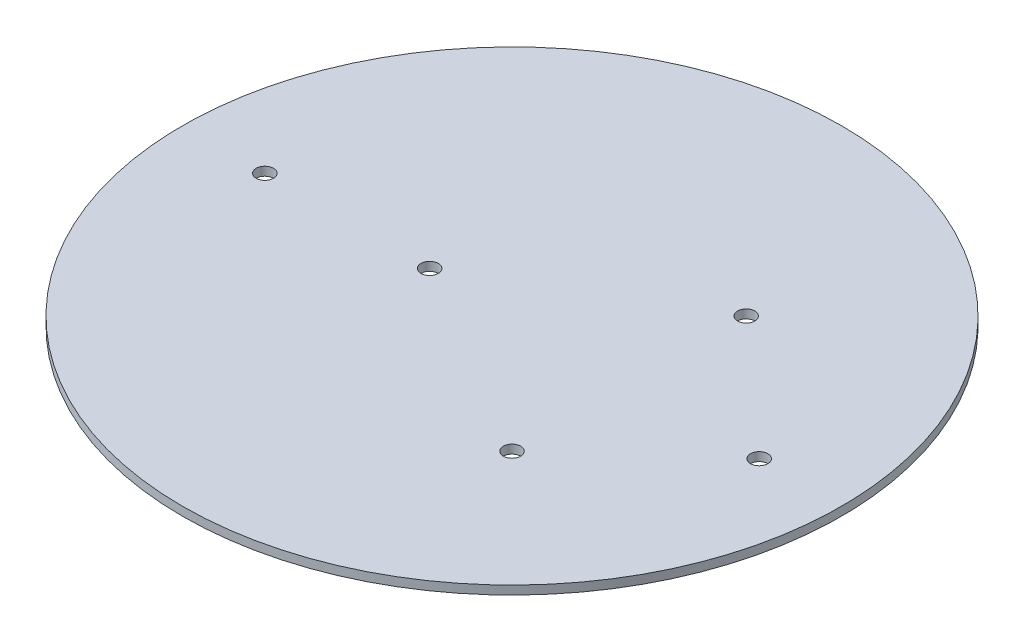
ISO-10303-21;
HEADER;
FILE_DESCRIPTION(('STEP AP214'),'2;1');
FILE_NAME('part.step','',(''),(''),'','','');
FILE_SCHEMA(('AUTOMOTIVE_DESIGN { 1 0 10303 214 1 1 1 1 }'));
ENDSEC;
DATA;
#1=APPLICATION_CONTEXT('core data for automotive mechanical design processes');
#2=APPLICATION_PROTOCOL_DEFINITION('international standard','automotive_design',2000,#1);
#3=PRODUCT_CONTEXT('',#1,'mechanical');
#4=PRODUCT('Part','Part','',(#3));
#5=PRODUCT_RELATED_PRODUCT_CATEGORY('part','',(#4));
#6=PRODUCT_DEFINITION_FORMATION('','',#4);
#7=PRODUCT_DEFINITION_CONTEXT('part definition',#1,'design');
#8=PRODUCT_DEFINITION('design','',#6,#7);
#9=PRODUCT_DEFINITION_SHAPE('','',#8);
#10=(LENGTH_UNIT() NAMED_UNIT(*) SI_UNIT(.MILLI.,.METRE.));
#11=(NAMED_UNIT(*) PLANE_ANGLE_UNIT() SI_UNIT($,.RADIAN.));
#12=(NAMED_UNIT(*) SI_UNIT($,.STERADIAN.) SOLID_ANGLE_UNIT());
#13=UNCERTAINTY_MEASURE_WITH_UNIT(LENGTH_MEASURE(1.E-05),#10,'distance_accuracy_value','');
#14=(GEOMETRIC_REPRESENTATION_CONTEXT(3) GLOBAL_UNCERTAINTY_ASSIGNED_CONTEXT((#13)) GLOBAL_UNIT_ASSIGNED_CONTEXT((#10,
#11,#12)) REPRESENTATION_CONTEXT('',''));
#15=CARTESIAN_POINT('',(0.,0.,0.));
#16=DIRECTION('',(0.,0.,1.));
#17=DIRECTION('',(1.,0.,0.));
#18=AXIS2_PLACEMENT_3D('',#15,#16,#17);
#19=CARTESIAN_POINT('',(28.5,-1.,0.));
#20=DIRECTION('',(0.,1.,0.));
#21=DIRECTION('',(0.,0.,1.));
#22=AXIS2_PLACEMENT_3D('',#19,#20,#21);
#23=CYLINDRICAL_SURFACE('',#22,1.);
#24=CARTESIAN_POINT('',(28.5,-1.,0.));
#25=DIRECTION('',(0.,1.,0.));
#26=DIRECTION('',(0.,0.,1.));
#27=AXIS2_PLACEMENT_3D('',#24,#25,#26);
#28=CIRCLE('',#27,1.);
#29=CARTESIAN_POINT('',(28.5,-1.,0.999999999999991));
#30=VERTEX_POINT('',#29);
#31=EDGE_CURVE('E52',#30,#30,#28,.T.);
#32=ORIENTED_EDGE('',*,*,#31,.F.);
#33=EDGE_LOOP('',(#32));
#34=FACE_BOUND('',#33,.T.);
#35=CARTESIAN_POINT('',(28.5,0.,0.));
#36=DIRECTION('',(0.,1.,0.));
#37=DIRECTION('',(0.,0.,1.));
#38=AXIS2_PLACEMENT_3D('',#35,#36,#37);
#39=CIRCLE('',#38,1.);
#40=CARTESIAN_POINT('',(28.5,0.,0.999999999999991));
#41=VERTEX_POINT('',#40);
#42=EDGE_CURVE('E77',#41,#41,#39,.T.);
#43=ORIENTED_EDGE('',*,*,#42,.T.);
#44=EDGE_LOOP('',(#43));
#45=FACE_BOUND('',#44,.T.);
#46=ADVANCED_FACE('F43',(#34,#45),#23,.F.);
#47=CARTESIAN_POINT('',(-28.5,-1.,0.));
#48=DIRECTION('',(0.,1.,0.));
#49=DIRECTION('',(0.,0.,1.));
#50=AXIS2_PLACEMENT_3D('',#47,#48,#49);
#51=CYLINDRICAL_SURFACE('',#50,1.);
#52=CARTESIAN_POINT('',(-28.5,-1.,0.));
#53=DIRECTION('',(0.,1.,0.));
#54=DIRECTION('',(0.,0.,1.));
#55=AXIS2_PLACEMENT_3D('',#52,#53,#54);
#56=CIRCLE('',#55,1.);
#57=CARTESIAN_POINT('',(-28.5,-1.,1.));
#58=VERTEX_POINT('',#57);
#59=EDGE_CURVE('E58',#58,#58,#56,.T.);
#60=ORIENTED_EDGE('',*,*,#59,.F.);
#61=EDGE_LOOP('',(#60));
#62=FACE_BOUND('',#61,.T.);
#63=CARTESIAN_POINT('',(-28.5,0.,0.));
#64=DIRECTION('',(0.,1.,0.));
#65=DIRECTION('',(0.,0.,1.));
#66=AXIS2_PLACEMENT_3D('',#63,#64,#65);
#67=CIRCLE('',#66,1.);
#68=CARTESIAN_POINT('',(-28.5,0.,1.));
#69=VERTEX_POINT('',#68);
#70=EDGE_CURVE('E74',#69,#69,#67,.T.);
#71=ORIENTED_EDGE('',*,*,#70,.T.);
#72=EDGE_LOOP('',(#71));
#73=FACE_BOUND('',#72,.T.);
#74=ADVANCED_FACE('F107',(#62,#73),#51,.F.);
#75=CARTESIAN_POINT('',(13.5,-1.,-13.5));
#76=DIRECTION('',(0.,1.,0.));
#77=DIRECTION('',(0.,0.,1.));
#78=AXIS2_PLACEMENT_3D('',#75,#76,#77);
#79=CYLINDRICAL_SURFACE('',#78,1.);
#80=CARTESIAN_POINT('',(13.5,-1.,-13.5));
#81=DIRECTION('',(0.,1.,0.));
#82=DIRECTION('',(0.,0.,1.));
#83=AXIS2_PLACEMENT_3D('',#80,#81,#82);
#84=CIRCLE('',#83,1.);
#85=CARTESIAN_POINT('',(13.5,-1.,-12.5));
#86=VERTEX_POINT('',#85);
#87=EDGE_CURVE('E95',#86,#86,#84,.T.);
#88=ORIENTED_EDGE('',*,*,#87,.F.);
#89=EDGE_LOOP('',(#88));
#90=FACE_BOUND('',#89,.T.);
#91=CARTESIAN_POINT('',(13.5,0.,-13.5));
#92=DIRECTION('',(0.,1.,0.));
#93=DIRECTION('',(0.,0.,1.));
#94=AXIS2_PLACEMENT_3D('',#91,#92,#93);
#95=CIRCLE('',#94,1.);
#96=CARTESIAN_POINT('',(13.5,0.,-12.5));
#97=VERTEX_POINT('',#96);
#98=EDGE_CURVE('E70',#97,#97,#95,.T.);
#99=ORIENTED_EDGE('',*,*,#98,.T.);
#100=EDGE_LOOP('',(#99));
#101=FACE_BOUND('',#100,.T.);
#102=ADVANCED_FACE('F110',(#90,#101),#79,.F.);
#103=CARTESIAN_POINT('',(13.5,-1.,13.5));
#104=DIRECTION('',(0.,1.,0.));
#105=DIRECTION('',(0.,0.,1.));
#106=AXIS2_PLACEMENT_3D('',#103,#104,#105);
#107=CYLINDRICAL_SURFACE('',#106,1.);
#108=CARTESIAN_POINT('',(13.5,-1.,13.5));
#109=DIRECTION('',(0.,1.,0.));
#110=DIRECTION('',(0.,0.,1.));
#111=AXIS2_PLACEMENT_3D('',#108,#109,#110);
#112=CIRCLE('',#111,1.);
#113=CARTESIAN_POINT('',(13.5,-1.,14.5));
#114=VERTEX_POINT('',#113);
#115=EDGE_CURVE('E89',#114,#114,#112,.T.);
#116=ORIENTED_EDGE('',*,*,#115,.F.);
#117=EDGE_LOOP('',(#116));
#118=FACE_BOUND('',#117,.T.);
#119=CARTESIAN_POINT('',(13.5,0.,13.5));
#120=DIRECTION('',(0.,1.,0.));
#121=DIRECTION('',(0.,0.,1.));
#122=AXIS2_PLACEMENT_3D('',#119,#120,#121);
#123=CIRCLE('',#122,1.);
#124=CARTESIAN_POINT('',(13.5,0.,14.5));
#125=VERTEX_POINT('',#124);
#126=EDGE_CURVE('E66',#125,#125,#123,.T.);
#127=ORIENTED_EDGE('',*,*,#126,.T.);
#128=EDGE_LOOP('',(#127));
#129=FACE_BOUND('',#128,.T.);
#130=ADVANCED_FACE('F135',(#118,#129),#107,.F.);
#131=CARTESIAN_POINT('',(-9.5,-1.,0.));
#132=DIRECTION('',(0.,1.,0.));
#133=DIRECTION('',(0.,0.,1.));
#134=AXIS2_PLACEMENT_3D('',#131,#132,#133);
#135=CYLINDRICAL_SURFACE('',#134,1.);
#136=CARTESIAN_POINT('',(-9.5,-1.,0.));
#137=DIRECTION('',(0.,1.,0.));
#138=DIRECTION('',(0.,0.,1.));
#139=AXIS2_PLACEMENT_3D('',#136,#137,#138);
#140=CIRCLE('',#139,1.);
#141=CARTESIAN_POINT('',(-9.5,-1.,1.));
#142=VERTEX_POINT('',#141);
#143=EDGE_CURVE('E84',#142,#142,#140,.T.);
#144=ORIENTED_EDGE('',*,*,#143,.F.);
#145=EDGE_LOOP('',(#144));
#146=FACE_BOUND('',#145,.T.);
#147=CARTESIAN_POINT('',(-9.5,0.,0.));
#148=DIRECTION('',(0.,1.,0.));
#149=DIRECTION('',(0.,0.,1.));
#150=AXIS2_PLACEMENT_3D('',#147,#148,#149);
#151=CIRCLE('',#150,1.);
#152=CARTESIAN_POINT('',(-9.5,0.,1.));
#153=VERTEX_POINT('',#152);
#154=EDGE_CURVE('E62',#153,#153,#151,.T.);
#155=ORIENTED_EDGE('',*,*,#154,.T.);
#156=EDGE_LOOP('',(#155));
#157=FACE_BOUND('',#156,.T.);
#158=ADVANCED_FACE('F45',(#146,#157),#135,.F.);
#159=CARTESIAN_POINT('',(0.,-1.,0.));
#160=DIRECTION('',(0.,1.,0.));
#161=DIRECTION('',(0.,0.,1.));
#162=AXIS2_PLACEMENT_3D('',#159,#160,#161);
#163=CYLINDRICAL_SURFACE('',#162,38.);
#164=CARTESIAN_POINT('',(0.,-1.,0.));
#165=DIRECTION('',(0.,1.,0.));
#166=DIRECTION('',(0.,0.,1.));
#167=AXIS2_PLACEMENT_3D('',#164,#165,#166);
#168=CIRCLE('',#167,38.);
#169=CARTESIAN_POINT('',(0.,-1.,38.));
#170=VERTEX_POINT('',#169);
#171=EDGE_CURVE('E10',#170,#170,#168,.T.);
#172=ORIENTED_EDGE('',*,*,#171,.T.);
#173=EDGE_LOOP('',(#172));
#174=FACE_BOUND('',#173,.T.);
#175=CARTESIAN_POINT('',(0.,0.,0.));
#176=DIRECTION('',(0.,1.,0.));
#177=DIRECTION('',(0.,0.,1.));
#178=AXIS2_PLACEMENT_3D('',#175,#176,#177);
#179=CIRCLE('',#178,38.);
#180=CARTESIAN_POINT('',(0.,0.,38.));
#181=VERTEX_POINT('',#180);
#182=EDGE_CURVE('E47',#181,#181,#179,.T.);
#183=ORIENTED_EDGE('',*,*,#182,.F.);
#184=EDGE_LOOP('',(#183));
#185=FACE_BOUND('',#184,.T.);
#186=ADVANCED_FACE('F122',(#174,#185),#163,.T.);
#187=CARTESIAN_POINT('',(0.,-1.,0.));
#188=DIRECTION('',(0.,1.,0.));
#189=DIRECTION('',(0.,0.,1.));
#190=AXIS2_PLACEMENT_3D('',#187,#188,#189);
#191=PLANE('',#190);
#192=ORIENTED_EDGE('',*,*,#143,.T.);
#193=EDGE_LOOP('',(#192));
#194=FACE_BOUND('',#193,.T.);
#195=ORIENTED_EDGE('',*,*,#115,.T.);
#196=EDGE_LOOP('',(#195));
#197=FACE_BOUND('',#196,.T.);
#198=ORIENTED_EDGE('',*,*,#87,.T.);
#199=EDGE_LOOP('',(#198));
#200=FACE_BOUND('',#199,.T.);
#201=ORIENTED_EDGE('',*,*,#59,.T.);
#202=EDGE_LOOP('',(#201));
#203=FACE_BOUND('',#202,.T.);
#204=ORIENTED_EDGE('',*,*,#31,.T.);
#205=EDGE_LOOP('',(#204));
#206=FACE_BOUND('',#205,.T.);
#207=ORIENTED_EDGE('',*,*,#171,.F.);
#208=EDGE_LOOP('',(#207));
#209=FACE_BOUND('',#208,.T.);
#210=ADVANCED_FACE('F104',(#194,#197,#200,#203,#206,#209),#191,.F.);
#211=CARTESIAN_POINT('',(0.,0.,0.));
#212=DIRECTION('',(0.,1.,0.));
#213=DIRECTION('',(0.,0.,1.));
#214=AXIS2_PLACEMENT_3D('',#211,#212,#213);
#215=PLANE('',#214);
#216=ORIENTED_EDGE('',*,*,#154,.F.);
#217=EDGE_LOOP('',(#216));
#218=FACE_BOUND('',#217,.T.);
#219=ORIENTED_EDGE('',*,*,#126,.F.);
#220=EDGE_LOOP('',(#219));
#221=FACE_BOUND('',#220,.T.);
#222=ORIENTED_EDGE('',*,*,#98,.F.);
#223=EDGE_LOOP('',(#222));
#224=FACE_BOUND('',#223,.T.);
#225=ORIENTED_EDGE('',*,*,#70,.F.);
#226=EDGE_LOOP('',(#225));
#227=FACE_BOUND('',#226,.T.);
#228=ORIENTED_EDGE('',*,*,#42,.F.);
#229=EDGE_LOOP('',(#228));
#230=FACE_BOUND('',#229,.T.);
#231=ORIENTED_EDGE('',*,*,#182,.T.);
#232=EDGE_LOOP('',(#231));
#233=FACE_BOUND('',#232,.T.);
#234=ADVANCED_FACE('F114',(#218,#221,#224,#227,#230,#233),#215,.T.);
#235=CLOSED_SHELL('',(#46,#74,#102,#130,#158,#186,#210,#234));
#236=MANIFOLD_SOLID_BREP('B2',#235);
#237=ADVANCED_BREP_SHAPE_REPRESENTATION('',(#18,#236),#14);
#238=SHAPE_DEFINITION_REPRESENTATION(#9,#237);
ENDSEC;
END-ISO-10303-21;
